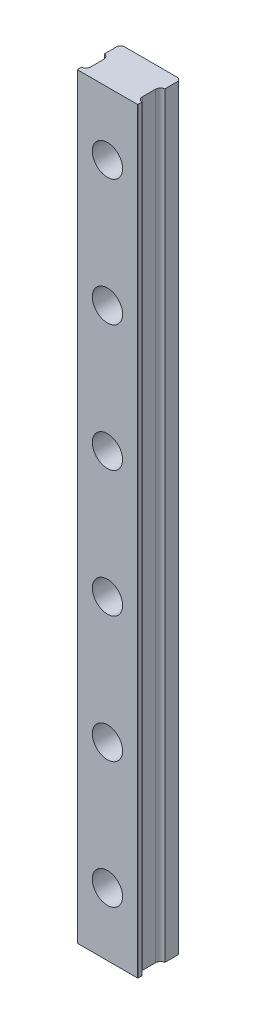
ISO-10303-21;
HEADER;
FILE_DESCRIPTION(('STEP AP214'),'2;1');
FILE_NAME('part.step','',(''),(''),'','','');
FILE_SCHEMA(('AUTOMOTIVE_DESIGN { 1 0 10303 214 1 1 1 1 }'));
ENDSEC;
DATA;
#1=APPLICATION_CONTEXT('core data for automotive mechanical design processes');
#2=APPLICATION_PROTOCOL_DEFINITION('international standard','automotive_design',2000,#1);
#3=PRODUCT_CONTEXT('',#1,'mechanical');
#4=PRODUCT('Part','Part','',(#3));
#5=PRODUCT_RELATED_PRODUCT_CATEGORY('part','',(#4));
#6=PRODUCT_DEFINITION_FORMATION('','',#4);
#7=PRODUCT_DEFINITION_CONTEXT('part definition',#1,'design');
#8=PRODUCT_DEFINITION('design','',#6,#7);
#9=PRODUCT_DEFINITION_SHAPE('','',#8);
#10=(LENGTH_UNIT() NAMED_UNIT(*) SI_UNIT(.MILLI.,.METRE.));
#11=(NAMED_UNIT(*) PLANE_ANGLE_UNIT() SI_UNIT($,.RADIAN.));
#12=(NAMED_UNIT(*) SI_UNIT($,.STERADIAN.) SOLID_ANGLE_UNIT());
#13=UNCERTAINTY_MEASURE_WITH_UNIT(LENGTH_MEASURE(1.E-05),#10,'distance_accuracy_value','');
#14=(GEOMETRIC_REPRESENTATION_CONTEXT(3) GLOBAL_UNCERTAINTY_ASSIGNED_CONTEXT((#13)) GLOBAL_UNIT_ASSIGNED_CONTEXT((#10,
#11,#12)) REPRESENTATION_CONTEXT('',''));
#15=CARTESIAN_POINT('',(0.,0.,0.));
#16=DIRECTION('',(0.,0.,1.));
#17=DIRECTION('',(1.,0.,0.));
#18=AXIS2_PLACEMENT_3D('',#15,#16,#17);
#19=CARTESIAN_POINT('',(0.,137.5,1.5));
#20=DIRECTION('',(0.,0.,1.));
#21=DIRECTION('',(0.,-1.,0.));
#22=AXIS2_PLACEMENT_3D('',#19,#20,#21);
#23=CYLINDRICAL_SURFACE('',#22,1.7);
#24=CARTESIAN_POINT('',(0.,137.5,0.));
#25=DIRECTION('',(0.,0.,1.));
#26=DIRECTION('',(0.,-1.,0.));
#27=AXIS2_PLACEMENT_3D('',#24,#25,#26);
#28=CIRCLE('',#27,1.7);
#29=CARTESIAN_POINT('',(0.,135.8,0.));
#30=VERTEX_POINT('',#29);
#31=EDGE_CURVE('E240',#30,#30,#28,.T.);
#32=ORIENTED_EDGE('',*,*,#31,.F.);
#33=EDGE_LOOP('',(#32));
#34=FACE_BOUND('',#33,.T.);
#35=CARTESIAN_POINT('',(0.,137.5,3.));
#36=DIRECTION('',(0.,0.,1.));
#37=DIRECTION('',(0.,-1.,0.));
#38=AXIS2_PLACEMENT_3D('',#35,#36,#37);
#39=CIRCLE('',#38,1.7);
#40=CARTESIAN_POINT('',(0.,135.8,3.));
#41=VERTEX_POINT('',#40);
#42=EDGE_CURVE('E334',#41,#41,#39,.T.);
#43=ORIENTED_EDGE('',*,*,#42,.T.);
#44=EDGE_LOOP('',(#43));
#45=FACE_BOUND('',#44,.T.);
#46=ADVANCED_FACE('F16',(#34,#45),#23,.F.);
#47=CARTESIAN_POINT('',(0.,112.5,1.5));
#48=DIRECTION('',(0.,0.,1.));
#49=DIRECTION('',(0.,-1.,0.));
#50=AXIS2_PLACEMENT_3D('',#47,#48,#49);
#51=CYLINDRICAL_SURFACE('',#50,1.7);
#52=CARTESIAN_POINT('',(0.,112.5,0.));
#53=DIRECTION('',(0.,0.,1.));
#54=DIRECTION('',(0.,-1.,0.));
#55=AXIS2_PLACEMENT_3D('',#52,#53,#54);
#56=CIRCLE('',#55,1.7);
#57=CARTESIAN_POINT('',(0.,110.8,0.));
#58=VERTEX_POINT('',#57);
#59=EDGE_CURVE('E315',#58,#58,#56,.T.);
#60=ORIENTED_EDGE('',*,*,#59,.F.);
#61=EDGE_LOOP('',(#60));
#62=FACE_BOUND('',#61,.T.);
#63=CARTESIAN_POINT('',(0.,112.5,3.));
#64=DIRECTION('',(0.,0.,1.));
#65=DIRECTION('',(0.,-1.,0.));
#66=AXIS2_PLACEMENT_3D('',#63,#64,#65);
#67=CIRCLE('',#66,1.7);
#68=CARTESIAN_POINT('',(0.,110.8,3.));
#69=VERTEX_POINT('',#68);
#70=EDGE_CURVE('E331',#69,#69,#67,.T.);
#71=ORIENTED_EDGE('',*,*,#70,.T.);
#72=EDGE_LOOP('',(#71));
#73=FACE_BOUND('',#72,.T.);
#74=ADVANCED_FACE('F522',(#62,#73),#51,.F.);
#75=CARTESIAN_POINT('',(0.,87.5,1.5));
#76=DIRECTION('',(0.,0.,1.));
#77=DIRECTION('',(0.,-1.,0.));
#78=AXIS2_PLACEMENT_3D('',#75,#76,#77);
#79=CYLINDRICAL_SURFACE('',#78,1.7);
#80=CARTESIAN_POINT('',(0.,87.5,0.));
#81=DIRECTION('',(0.,0.,1.));
#82=DIRECTION('',(0.,-1.,0.));
#83=AXIS2_PLACEMENT_3D('',#80,#81,#82);
#84=CIRCLE('',#83,1.7);
#85=CARTESIAN_POINT('',(0.,85.8,0.));
#86=VERTEX_POINT('',#85);
#87=EDGE_CURVE('E312',#86,#86,#84,.T.);
#88=ORIENTED_EDGE('',*,*,#87,.F.);
#89=EDGE_LOOP('',(#88));
#90=FACE_BOUND('',#89,.T.);
#91=CARTESIAN_POINT('',(0.,87.5,3.));
#92=DIRECTION('',(0.,0.,1.));
#93=DIRECTION('',(0.,-1.,0.));
#94=AXIS2_PLACEMENT_3D('',#91,#92,#93);
#95=CIRCLE('',#94,1.7);
#96=CARTESIAN_POINT('',(0.,85.8,3.));
#97=VERTEX_POINT('',#96);
#98=EDGE_CURVE('E328',#97,#97,#95,.T.);
#99=ORIENTED_EDGE('',*,*,#98,.T.);
#100=EDGE_LOOP('',(#99));
#101=FACE_BOUND('',#100,.T.);
#102=ADVANCED_FACE('F519',(#90,#101),#79,.F.);
#103=CARTESIAN_POINT('',(0.,62.5,1.5));
#104=DIRECTION('',(0.,0.,1.));
#105=DIRECTION('',(0.,-1.,0.));
#106=AXIS2_PLACEMENT_3D('',#103,#104,#105);
#107=CYLINDRICAL_SURFACE('',#106,1.7);
#108=CARTESIAN_POINT('',(0.,62.5,0.));
#109=DIRECTION('',(0.,0.,1.));
#110=DIRECTION('',(0.,-1.,0.));
#111=AXIS2_PLACEMENT_3D('',#108,#109,#110);
#112=CIRCLE('',#111,1.7);
#113=CARTESIAN_POINT('',(0.,60.8,0.));
#114=VERTEX_POINT('',#113);
#115=EDGE_CURVE('E309',#114,#114,#112,.T.);
#116=ORIENTED_EDGE('',*,*,#115,.F.);
#117=EDGE_LOOP('',(#116));
#118=FACE_BOUND('',#117,.T.);
#119=CARTESIAN_POINT('',(0.,62.5,3.));
#120=DIRECTION('',(0.,0.,1.));
#121=DIRECTION('',(0.,-1.,0.));
#122=AXIS2_PLACEMENT_3D('',#119,#120,#121);
#123=CIRCLE('',#122,1.7);
#124=CARTESIAN_POINT('',(0.,60.8,3.));
#125=VERTEX_POINT('',#124);
#126=EDGE_CURVE('E325',#125,#125,#123,.T.);
#127=ORIENTED_EDGE('',*,*,#126,.T.);
#128=EDGE_LOOP('',(#127));
#129=FACE_BOUND('',#128,.T.);
#130=ADVANCED_FACE('F515',(#118,#129),#107,.F.);
#131=CARTESIAN_POINT('',(0.,37.5,1.5));
#132=DIRECTION('',(0.,0.,1.));
#133=DIRECTION('',(0.,-1.,0.));
#134=AXIS2_PLACEMENT_3D('',#131,#132,#133);
#135=CYLINDRICAL_SURFACE('',#134,1.7);
#136=CARTESIAN_POINT('',(0.,37.5,0.));
#137=DIRECTION('',(0.,0.,1.));
#138=DIRECTION('',(0.,-1.,0.));
#139=AXIS2_PLACEMENT_3D('',#136,#137,#138);
#140=CIRCLE('',#139,1.7);
#141=CARTESIAN_POINT('',(0.,35.8,0.));
#142=VERTEX_POINT('',#141);
#143=EDGE_CURVE('E306',#142,#142,#140,.T.);
#144=ORIENTED_EDGE('',*,*,#143,.F.);
#145=EDGE_LOOP('',(#144));
#146=FACE_BOUND('',#145,.T.);
#147=CARTESIAN_POINT('',(0.,37.5,3.));
#148=DIRECTION('',(0.,0.,1.));
#149=DIRECTION('',(0.,-1.,0.));
#150=AXIS2_PLACEMENT_3D('',#147,#148,#149);
#151=CIRCLE('',#150,1.7);
#152=CARTESIAN_POINT('',(0.,35.8,3.));
#153=VERTEX_POINT('',#152);
#154=EDGE_CURVE('E322',#153,#153,#151,.T.);
#155=ORIENTED_EDGE('',*,*,#154,.T.);
#156=EDGE_LOOP('',(#155));
#157=FACE_BOUND('',#156,.T.);
#158=ADVANCED_FACE('F511',(#146,#157),#135,.F.);
#159=CARTESIAN_POINT('',(0.,12.5,1.5));
#160=DIRECTION('',(0.,0.,1.));
#161=DIRECTION('',(0.,-1.,0.));
#162=AXIS2_PLACEMENT_3D('',#159,#160,#161);
#163=CYLINDRICAL_SURFACE('',#162,1.7);
#164=CARTESIAN_POINT('',(0.,12.5,0.));
#165=DIRECTION('',(0.,0.,1.));
#166=DIRECTION('',(0.,-1.,0.));
#167=AXIS2_PLACEMENT_3D('',#164,#165,#166);
#168=CIRCLE('',#167,1.7);
#169=CARTESIAN_POINT('',(0.,10.8,0.));
#170=VERTEX_POINT('',#169);
#171=EDGE_CURVE('E267',#170,#170,#168,.T.);
#172=ORIENTED_EDGE('',*,*,#171,.F.);
#173=EDGE_LOOP('',(#172));
#174=FACE_BOUND('',#173,.T.);
#175=CARTESIAN_POINT('',(0.,12.5,3.));
#176=DIRECTION('',(0.,0.,1.));
#177=DIRECTION('',(0.,-1.,0.));
#178=AXIS2_PLACEMENT_3D('',#175,#176,#177);
#179=CIRCLE('',#178,1.7);
#180=CARTESIAN_POINT('',(0.,10.8,3.));
#181=VERTEX_POINT('',#180);
#182=EDGE_CURVE('E204',#181,#181,#179,.T.);
#183=ORIENTED_EDGE('',*,*,#182,.T.);
#184=EDGE_LOOP('',(#183));
#185=FACE_BOUND('',#184,.T.);
#186=ADVANCED_FACE('F507',(#174,#185),#163,.F.);
#187=CARTESIAN_POINT('',(5.75,0.,0.250000000000001));
#188=DIRECTION('',(0.707106781186548,0.,-0.707106781186548));
#189=DIRECTION('',(-0.707106781186548,0.,-0.707106781186548));
#190=AXIS2_PLACEMENT_3D('',#187,#188,#189);
#191=PLANE('',#190);
#192=DIRECTION('',(-0.707106781186548,0.,-0.707106781186548));
#193=VECTOR('',#192,1.);
#194=CARTESIAN_POINT('',(5.75,0.,0.250000000000001));
#195=LINE('',#194,#193);
#196=CARTESIAN_POINT('',(6.,0.,0.499999999999999));
#197=VERTEX_POINT('',#196);
#198=CARTESIAN_POINT('',(5.5,0.,0.));
#199=VERTEX_POINT('',#198);
#200=EDGE_CURVE('E138',#197,#199,#195,.T.);
#201=ORIENTED_EDGE('',*,*,#200,.T.);
#202=DIRECTION('',(0.,1.,0.));
#203=VECTOR('',#202,1.);
#204=CARTESIAN_POINT('',(5.5,0.,0.));
#205=LINE('',#204,#203);
#206=CARTESIAN_POINT('',(5.5,150.,0.));
#207=VERTEX_POINT('',#206);
#208=EDGE_CURVE('E252',#207,#199,#205,.F.);
#209=ORIENTED_EDGE('',*,*,#208,.F.);
#210=DIRECTION('',(-0.707106781186548,0.,-0.707106781186548));
#211=VECTOR('',#210,1.);
#212=CARTESIAN_POINT('',(5.75,150.,0.249999999999996));
#213=LINE('',#212,#211);
#214=CARTESIAN_POINT('',(6.,150.,0.499999999999995));
#215=VERTEX_POINT('',#214);
#216=EDGE_CURVE('E233',#207,#215,#213,.F.);
#217=ORIENTED_EDGE('',*,*,#216,.T.);
#218=DIRECTION('',(0.,1.,0.));
#219=VECTOR('',#218,1.);
#220=CARTESIAN_POINT('',(6.,0.,0.500000000000001));
#221=LINE('',#220,#219);
#222=EDGE_CURVE('E193',#197,#215,#221,.T.);
#223=ORIENTED_EDGE('',*,*,#222,.F.);
#224=EDGE_LOOP('',(#201,#209,#217,#223));
#225=FACE_BOUND('',#224,.T.);
#226=ADVANCED_FACE('F504',(#225),#191,.T.);
#227=CARTESIAN_POINT('',(6.12499999672743,0.,4.19999999876308));
#228=DIRECTION('',(0.,1.,0.));
#229=DIRECTION('',(0.,0.,1.));
#230=AXIS2_PLACEMENT_3D('',#227,#228,#229);
#231=CYLINDRICAL_SURFACE('',#230,0.999999996727427);
#232=CARTESIAN_POINT('',(6.12499999672743,0.,4.19999999876308));
#233=DIRECTION('',(0.,1.,0.));
#234=DIRECTION('',(0.,0.,1.));
#235=AXIS2_PLACEMENT_3D('',#232,#233,#234);
#236=CIRCLE('',#235,0.999999996727427);
#237=CARTESIAN_POINT('',(5.125,0.,4.19999999938154));
#238=VERTEX_POINT('',#237);
#239=CARTESIAN_POINT('',(6.,0.,3.20784326));
#240=VERTEX_POINT('',#239);
#241=EDGE_CURVE('E137',#238,#240,#236,.F.);
#242=ORIENTED_EDGE('',*,*,#241,.T.);
#243=DIRECTION('',(0.,1.,0.));
#244=VECTOR('',#243,1.);
#245=CARTESIAN_POINT('',(6.,0.,3.20784325999999));
#246=LINE('',#245,#244);
#247=CARTESIAN_POINT('',(6.,150.,3.20784325999999));
#248=VERTEX_POINT('',#247);
#249=EDGE_CURVE('E135',#248,#240,#246,.F.);
#250=ORIENTED_EDGE('',*,*,#249,.F.);
#251=CARTESIAN_POINT('',(6.12499999672743,150.,4.19999999876307));
#252=DIRECTION('',(0.,1.,0.));
#253=DIRECTION('',(0.,0.,1.));
#254=AXIS2_PLACEMENT_3D('',#251,#252,#253);
#255=CIRCLE('',#254,0.999999996727427);
#256=CARTESIAN_POINT('',(5.125,150.,4.19999999938154));
#257=VERTEX_POINT('',#256);
#258=EDGE_CURVE('E19',#248,#257,#255,.T.);
#259=ORIENTED_EDGE('',*,*,#258,.T.);
#260=DIRECTION('',(0.,1.,0.));
#261=VECTOR('',#260,1.);
#262=CARTESIAN_POINT('',(5.125,0.,4.2));
#263=LINE('',#262,#261);
#264=EDGE_CURVE('E132',#238,#257,#263,.T.);
#265=ORIENTED_EDGE('',*,*,#264,.F.);
#266=EDGE_LOOP('',(#242,#250,#259,#265));
#267=FACE_BOUND('',#266,.T.);
#268=ADVANCED_FACE('F131',(#267),#231,.F.);
#269=CARTESIAN_POINT('',(-6.12499999672743,0.,6.80000000123692));
#270=DIRECTION('',(0.,1.,0.));
#271=DIRECTION('',(0.,0.,1.));
#272=AXIS2_PLACEMENT_3D('',#269,#270,#271);
#273=CYLINDRICAL_SURFACE('',#272,0.999999996727429);
#274=CARTESIAN_POINT('',(-6.12499999672743,0.,6.80000000123692));
#275=DIRECTION('',(0.,1.,0.));
#276=DIRECTION('',(0.,0.,1.));
#277=AXIS2_PLACEMENT_3D('',#274,#275,#276);
#278=CIRCLE('',#277,0.999999996727429);
#279=CARTESIAN_POINT('',(-5.125,0.,6.80000000061846));
#280=VERTEX_POINT('',#279);
#281=CARTESIAN_POINT('',(-6.,0.,7.79215674));
#282=VERTEX_POINT('',#281);
#283=EDGE_CURVE('E225',#280,#282,#278,.F.);
#284=ORIENTED_EDGE('',*,*,#283,.T.);
#285=DIRECTION('',(0.,1.,0.));
#286=VECTOR('',#285,1.);
#287=CARTESIAN_POINT('',(-6.,0.,7.79215673999999));
#288=LINE('',#287,#286);
#289=CARTESIAN_POINT('',(-6.,150.,7.79215673999999));
#290=VERTEX_POINT('',#289);
#291=EDGE_CURVE('E200',#290,#282,#288,.F.);
#292=ORIENTED_EDGE('',*,*,#291,.F.);
#293=CARTESIAN_POINT('',(-6.12499999672743,150.,6.80000000123691));
#294=DIRECTION('',(0.,1.,0.));
#295=DIRECTION('',(0.,0.,1.));
#296=AXIS2_PLACEMENT_3D('',#293,#294,#295);
#297=CIRCLE('',#296,0.999999996727429);
#298=CARTESIAN_POINT('',(-5.125,150.,6.80000000061845));
#299=VERTEX_POINT('',#298);
#300=EDGE_CURVE('E344',#290,#299,#297,.T.);
#301=ORIENTED_EDGE('',*,*,#300,.T.);
#302=DIRECTION('',(0.,1.,0.));
#303=VECTOR('',#302,1.);
#304=CARTESIAN_POINT('',(-5.125,0.,6.8));
#305=LINE('',#304,#303);
#306=EDGE_CURVE('E172',#280,#299,#305,.T.);
#307=ORIENTED_EDGE('',*,*,#306,.F.);
#308=EDGE_LOOP('',(#284,#292,#301,#307));
#309=FACE_BOUND('',#308,.T.);
#310=ADVANCED_FACE('F375',(#309),#273,.F.);
#311=CARTESIAN_POINT('',(-5.75,0.,0.25));
#312=DIRECTION('',(-0.707106781186548,0.,-0.707106781186548));
#313=DIRECTION('',(-0.707106781186548,0.,0.707106781186548));
#314=AXIS2_PLACEMENT_3D('',#311,#312,#313);
#315=PLANE('',#314);
#316=DIRECTION('',(-0.707106781186548,0.,0.707106781186548));
#317=VECTOR('',#316,1.);
#318=CARTESIAN_POINT('',(-5.75,0.,0.25));
#319=LINE('',#318,#317);
#320=CARTESIAN_POINT('',(-5.5,0.,0.));
#321=VERTEX_POINT('',#320);
#322=CARTESIAN_POINT('',(-6.,0.,0.499999999999997));
#323=VERTEX_POINT('',#322);
#324=EDGE_CURVE('E224',#321,#323,#319,.T.);
#325=ORIENTED_EDGE('',*,*,#324,.T.);
#326=DIRECTION('',(0.,1.,0.));
#327=VECTOR('',#326,1.);
#328=CARTESIAN_POINT('',(-6.,0.,0.499999999999991));
#329=LINE('',#328,#327);
#330=CARTESIAN_POINT('',(-6.,150.,0.499999999999992));
#331=VERTEX_POINT('',#330);
#332=EDGE_CURVE('E169',#331,#323,#329,.F.);
#333=ORIENTED_EDGE('',*,*,#332,.F.);
#334=DIRECTION('',(-0.707106781186548,0.,0.707106781186548));
#335=VECTOR('',#334,1.);
#336=CARTESIAN_POINT('',(-5.75,150.,0.249999999999995));
#337=LINE('',#336,#335);
#338=CARTESIAN_POINT('',(-5.5,150.,0.));
#339=VERTEX_POINT('',#338);
#340=EDGE_CURVE('E222',#331,#339,#337,.F.);
#341=ORIENTED_EDGE('',*,*,#340,.T.);
#342=DIRECTION('',(0.,1.,0.));
#343=VECTOR('',#342,1.);
#344=CARTESIAN_POINT('',(-5.5,0.,0.));
#345=LINE('',#344,#343);
#346=EDGE_CURVE('E195',#321,#339,#345,.T.);
#347=ORIENTED_EDGE('',*,*,#346,.F.);
#348=EDGE_LOOP('',(#325,#333,#341,#347));
#349=FACE_BOUND('',#348,.T.);
#350=ADVANCED_FACE('F495',(#349),#315,.T.);
#351=CARTESIAN_POINT('',(-6.12500000163629,0.,4.20000000309229));
#352=DIRECTION('',(0.,1.,0.));
#353=DIRECTION('',(0.,0.,1.));
#354=AXIS2_PLACEMENT_3D('',#351,#352,#353);
#355=CYLINDRICAL_SURFACE('',#354,1.00000000163629);
#356=CARTESIAN_POINT('',(-6.12500000163629,0.,4.20000000309229));
#357=DIRECTION('',(0.,1.,0.));
#358=DIRECTION('',(0.,0.,1.));
#359=AXIS2_PLACEMENT_3D('',#356,#357,#358);
#360=CIRCLE('',#359,1.00000000163629);
#361=CARTESIAN_POINT('',(-6.,0.,3.20784326));
#362=VERTEX_POINT('',#361);
#363=CARTESIAN_POINT('',(-5.125,0.,4.20000000154614));
#364=VERTEX_POINT('',#363);
#365=EDGE_CURVE('E340',#362,#364,#360,.F.);
#366=ORIENTED_EDGE('',*,*,#365,.T.);
#367=DIRECTION('',(0.,1.,0.));
#368=VECTOR('',#367,1.);
#369=CARTESIAN_POINT('',(-5.125,0.,4.19999999999999));
#370=LINE('',#369,#368);
#371=CARTESIAN_POINT('',(-5.125,150.,4.20000000154613));
#372=VERTEX_POINT('',#371);
#373=EDGE_CURVE('E146',#372,#364,#370,.F.);
#374=ORIENTED_EDGE('',*,*,#373,.F.);
#375=CARTESIAN_POINT('',(-6.12500000163629,150.,4.20000000309228));
#376=DIRECTION('',(0.,1.,0.));
#377=DIRECTION('',(0.,0.,1.));
#378=AXIS2_PLACEMENT_3D('',#375,#376,#377);
#379=CIRCLE('',#378,1.00000000163629);
#380=CARTESIAN_POINT('',(-6.,150.,3.20784326));
#381=VERTEX_POINT('',#380);
#382=EDGE_CURVE('E229',#372,#381,#379,.T.);
#383=ORIENTED_EDGE('',*,*,#382,.T.);
#384=DIRECTION('',(0.,1.,0.));
#385=VECTOR('',#384,1.);
#386=CARTESIAN_POINT('',(-6.,0.,3.20784326));
#387=LINE('',#386,#385);
#388=EDGE_CURVE('E165',#362,#381,#387,.T.);
#389=ORIENTED_EDGE('',*,*,#388,.F.);
#390=EDGE_LOOP('',(#366,#374,#383,#389));
#391=FACE_BOUND('',#390,.T.);
#392=ADVANCED_FACE('F491',(#391),#355,.F.);
#393=CARTESIAN_POINT('',(6.12500000163629,0.,6.79999999690771));
#394=DIRECTION('',(0.,1.,0.));
#395=DIRECTION('',(0.,0.,1.));
#396=AXIS2_PLACEMENT_3D('',#393,#394,#395);
#397=CYLINDRICAL_SURFACE('',#396,1.00000000163628);
#398=CARTESIAN_POINT('',(6.12500000163629,0.,6.79999999690771));
#399=DIRECTION('',(0.,1.,0.));
#400=DIRECTION('',(0.,0.,1.));
#401=AXIS2_PLACEMENT_3D('',#398,#399,#400);
#402=CIRCLE('',#401,1.00000000163628);
#403=CARTESIAN_POINT('',(6.,0.,7.79215674));
#404=VERTEX_POINT('',#403);
#405=CARTESIAN_POINT('',(5.125,0.,6.79999999845385));
#406=VERTEX_POINT('',#405);
#407=EDGE_CURVE('E337',#404,#406,#402,.F.);
#408=ORIENTED_EDGE('',*,*,#407,.T.);
#409=DIRECTION('',(0.,1.,0.));
#410=VECTOR('',#409,1.);
#411=CARTESIAN_POINT('',(5.125,0.,6.79999999999999));
#412=LINE('',#411,#410);
#413=CARTESIAN_POINT('',(5.125,150.,6.79999999845385));
#414=VERTEX_POINT('',#413);
#415=EDGE_CURVE('E147',#414,#406,#412,.F.);
#416=ORIENTED_EDGE('',*,*,#415,.F.);
#417=CARTESIAN_POINT('',(6.12500000163629,150.,6.7999999969077));
#418=DIRECTION('',(0.,1.,0.));
#419=DIRECTION('',(0.,0.,1.));
#420=AXIS2_PLACEMENT_3D('',#417,#418,#419);
#421=CIRCLE('',#420,1.00000000163628);
#422=CARTESIAN_POINT('',(6.,150.,7.79215674));
#423=VERTEX_POINT('',#422);
#424=EDGE_CURVE('E151',#414,#423,#421,.T.);
#425=ORIENTED_EDGE('',*,*,#424,.T.);
#426=DIRECTION('',(0.,1.,0.));
#427=VECTOR('',#426,1.);
#428=CARTESIAN_POINT('',(6.,0.,7.79215674));
#429=LINE('',#428,#427);
#430=EDGE_CURVE('E168',#404,#423,#429,.T.);
#431=ORIENTED_EDGE('',*,*,#430,.F.);
#432=EDGE_LOOP('',(#408,#416,#425,#431));
#433=FACE_BOUND('',#432,.T.);
#434=ADVANCED_FACE('F487',(#433),#397,.F.);
#435=CARTESIAN_POINT('',(2.35,137.5,3.));
#436=DIRECTION('',(0.,0.,-1.));
#437=DIRECTION('',(0.,1.,0.));
#438=AXIS2_PLACEMENT_3D('',#435,#436,#437);
#439=PLANE('',#438);
#440=ORIENTED_EDGE('',*,*,#42,.F.);
#441=EDGE_LOOP('',(#440));
#442=FACE_BOUND('',#441,.T.);
#443=CARTESIAN_POINT('',(0.,137.5,3.));
#444=DIRECTION('',(0.,0.,1.));
#445=DIRECTION('',(0.,-1.,0.));
#446=AXIS2_PLACEMENT_3D('',#443,#444,#445);
#447=CIRCLE('',#446,3.);
#448=CARTESIAN_POINT('',(0.,134.5,3.));
#449=VERTEX_POINT('',#448);
#450=EDGE_CURVE('E181',#449,#449,#447,.T.);
#451=ORIENTED_EDGE('',*,*,#450,.T.);
#452=EDGE_LOOP('',(#451));
#453=FACE_BOUND('',#452,.T.);
#454=ADVANCED_FACE('F483',(#442,#453),#439,.F.);
#455=CARTESIAN_POINT('',(2.35,112.5,3.));
#456=DIRECTION('',(0.,0.,-1.));
#457=DIRECTION('',(0.,1.,0.));
#458=AXIS2_PLACEMENT_3D('',#455,#456,#457);
#459=PLANE('',#458);
#460=ORIENTED_EDGE('',*,*,#70,.F.);
#461=EDGE_LOOP('',(#460));
#462=FACE_BOUND('',#461,.T.);
#463=CARTESIAN_POINT('',(0.,112.5,3.));
#464=DIRECTION('',(0.,0.,1.));
#465=DIRECTION('',(0.,-1.,0.));
#466=AXIS2_PLACEMENT_3D('',#463,#464,#465);
#467=CIRCLE('',#466,3.);
#468=CARTESIAN_POINT('',(0.,109.5,3.));
#469=VERTEX_POINT('',#468);
#470=EDGE_CURVE('E299',#469,#469,#467,.T.);
#471=ORIENTED_EDGE('',*,*,#470,.T.);
#472=EDGE_LOOP('',(#471));
#473=FACE_BOUND('',#472,.T.);
#474=ADVANCED_FACE('F479',(#462,#473),#459,.F.);
#475=CARTESIAN_POINT('',(2.35,87.5,3.));
#476=DIRECTION('',(0.,0.,-1.));
#477=DIRECTION('',(0.,1.,0.));
#478=AXIS2_PLACEMENT_3D('',#475,#476,#477);
#479=PLANE('',#478);
#480=ORIENTED_EDGE('',*,*,#98,.F.);
#481=EDGE_LOOP('',(#480));
#482=FACE_BOUND('',#481,.T.);
#483=CARTESIAN_POINT('',(0.,87.5,3.));
#484=DIRECTION('',(0.,0.,1.));
#485=DIRECTION('',(0.,-1.,0.));
#486=AXIS2_PLACEMENT_3D('',#483,#484,#485);
#487=CIRCLE('',#486,3.);
#488=CARTESIAN_POINT('',(0.,84.5,3.));
#489=VERTEX_POINT('',#488);
#490=EDGE_CURVE('E296',#489,#489,#487,.T.);
#491=ORIENTED_EDGE('',*,*,#490,.T.);
#492=EDGE_LOOP('',(#491));
#493=FACE_BOUND('',#492,.T.);
#494=ADVANCED_FACE('F475',(#482,#493),#479,.F.);
#495=CARTESIAN_POINT('',(2.35,62.5,3.));
#496=DIRECTION('',(0.,0.,-1.));
#497=DIRECTION('',(0.,1.,0.));
#498=AXIS2_PLACEMENT_3D('',#495,#496,#497);
#499=PLANE('',#498);
#500=ORIENTED_EDGE('',*,*,#126,.F.);
#501=EDGE_LOOP('',(#500));
#502=FACE_BOUND('',#501,.T.);
#503=CARTESIAN_POINT('',(0.,62.5,3.));
#504=DIRECTION('',(0.,0.,1.));
#505=DIRECTION('',(0.,-1.,0.));
#506=AXIS2_PLACEMENT_3D('',#503,#504,#505);
#507=CIRCLE('',#506,3.);
#508=CARTESIAN_POINT('',(0.,59.5,3.));
#509=VERTEX_POINT('',#508);
#510=EDGE_CURVE('E293',#509,#509,#507,.T.);
#511=ORIENTED_EDGE('',*,*,#510,.T.);
#512=EDGE_LOOP('',(#511));
#513=FACE_BOUND('',#512,.T.);
#514=ADVANCED_FACE('F471',(#502,#513),#499,.F.);
#515=CARTESIAN_POINT('',(2.35,37.5,3.));
#516=DIRECTION('',(0.,0.,-1.));
#517=DIRECTION('',(0.,1.,0.));
#518=AXIS2_PLACEMENT_3D('',#515,#516,#517);
#519=PLANE('',#518);
#520=ORIENTED_EDGE('',*,*,#154,.F.);
#521=EDGE_LOOP('',(#520));
#522=FACE_BOUND('',#521,.T.);
#523=CARTESIAN_POINT('',(0.,37.5,3.));
#524=DIRECTION('',(0.,0.,1.));
#525=DIRECTION('',(0.,-1.,0.));
#526=AXIS2_PLACEMENT_3D('',#523,#524,#525);
#527=CIRCLE('',#526,3.);
#528=CARTESIAN_POINT('',(0.,34.5,3.));
#529=VERTEX_POINT('',#528);
#530=EDGE_CURVE('E290',#529,#529,#527,.T.);
#531=ORIENTED_EDGE('',*,*,#530,.T.);
#532=EDGE_LOOP('',(#531));
#533=FACE_BOUND('',#532,.T.);
#534=ADVANCED_FACE('F467',(#522,#533),#519,.F.);
#535=CARTESIAN_POINT('',(2.35,12.5,3.));
#536=DIRECTION('',(0.,0.,-1.));
#537=DIRECTION('',(0.,1.,0.));
#538=AXIS2_PLACEMENT_3D('',#535,#536,#537);
#539=PLANE('',#538);
#540=ORIENTED_EDGE('',*,*,#182,.F.);
#541=EDGE_LOOP('',(#540));
#542=FACE_BOUND('',#541,.T.);
#543=CARTESIAN_POINT('',(0.,12.5,3.));
#544=DIRECTION('',(0.,0.,1.));
#545=DIRECTION('',(0.,-1.,0.));
#546=AXIS2_PLACEMENT_3D('',#543,#544,#545);
#547=CIRCLE('',#546,3.);
#548=CARTESIAN_POINT('',(0.,9.5,3.));
#549=VERTEX_POINT('',#548);
#550=EDGE_CURVE('E158',#549,#549,#547,.T.);
#551=ORIENTED_EDGE('',*,*,#550,.T.);
#552=EDGE_LOOP('',(#551));
#553=FACE_BOUND('',#552,.T.);
#554=ADVANCED_FACE('F464',(#542,#553),#539,.F.);
#555=CARTESIAN_POINT('',(-6.,0.,8.17107837));
#556=DIRECTION('',(-1.,0.,0.));
#557=DIRECTION('',(0.,0.,1.));
#558=AXIS2_PLACEMENT_3D('',#555,#556,#557);
#559=PLANE('',#558);
#560=DIRECTION('',(0.,0.,1.));
#561=VECTOR('',#560,1.);
#562=CARTESIAN_POINT('',(-6.,0.,8.17107837));
#563=LINE('',#562,#561);
#564=CARTESIAN_POINT('',(-6.,0.,8.55));
#565=VERTEX_POINT('',#564);
#566=EDGE_CURVE('E203',#282,#565,#563,.T.);
#567=ORIENTED_EDGE('',*,*,#566,.T.);
#568=DIRECTION('',(0.,1.,0.));
#569=VECTOR('',#568,1.);
#570=CARTESIAN_POINT('',(-6.,0.,8.55));
#571=LINE('',#570,#569);
#572=CARTESIAN_POINT('',(-6.,150.,8.54999999999999));
#573=VERTEX_POINT('',#572);
#574=EDGE_CURVE('E205',#573,#565,#571,.F.);
#575=ORIENTED_EDGE('',*,*,#574,.F.);
#576=DIRECTION('',(0.,0.,-1.));
#577=VECTOR('',#576,1.);
#578=CARTESIAN_POINT('',(-6.,150.,4.40728174978889));
#579=LINE('',#578,#577);
#580=EDGE_CURVE('E156',#573,#290,#579,.T.);
#581=ORIENTED_EDGE('',*,*,#580,.T.);
#582=ORIENTED_EDGE('',*,*,#291,.T.);
#583=EDGE_LOOP('',(#567,#575,#581,#582));
#584=FACE_BOUND('',#583,.T.);
#585=ADVANCED_FACE('F369',(#584),#559,.T.);
#586=CARTESIAN_POINT('',(0.,0.,0.));
#587=DIRECTION('',(0.,0.,-1.));
#588=DIRECTION('',(-1.,0.,0.));
#589=AXIS2_PLACEMENT_3D('',#586,#587,#588);
#590=PLANE('',#589);
#591=DIRECTION('',(1.,0.,0.));
#592=VECTOR('',#591,1.);
#593=CARTESIAN_POINT('',(0.,0.,0.));
#594=LINE('',#593,#592);
#595=EDGE_CURVE('E208',#321,#199,#594,.T.);
#596=ORIENTED_EDGE('',*,*,#595,.F.);
#597=ORIENTED_EDGE('',*,*,#346,.T.);
#598=DIRECTION('',(1.,0.,0.));
#599=VECTOR('',#598,1.);
#600=CARTESIAN_POINT('',(0.,150.,0.));
#601=LINE('',#600,#599);
#602=EDGE_CURVE('E214',#339,#207,#601,.T.);
#603=ORIENTED_EDGE('',*,*,#602,.T.);
#604=ORIENTED_EDGE('',*,*,#208,.T.);
#605=EDGE_LOOP('',(#596,#597,#603,#604));
#606=FACE_BOUND('',#605,.T.);
#607=ORIENTED_EDGE('',*,*,#171,.T.);
#608=EDGE_LOOP('',(#607));
#609=FACE_BOUND('',#608,.T.);
#610=ORIENTED_EDGE('',*,*,#143,.T.);
#611=EDGE_LOOP('',(#610));
#612=FACE_BOUND('',#611,.T.);
#613=ORIENTED_EDGE('',*,*,#115,.T.);
#614=EDGE_LOOP('',(#613));
#615=FACE_BOUND('',#614,.T.);
#616=ORIENTED_EDGE('',*,*,#87,.T.);
#617=EDGE_LOOP('',(#616));
#618=FACE_BOUND('',#617,.T.);
#619=ORIENTED_EDGE('',*,*,#59,.T.);
#620=EDGE_LOOP('',(#619));
#621=FACE_BOUND('',#620,.T.);
#622=ORIENTED_EDGE('',*,*,#31,.T.);
#623=EDGE_LOOP('',(#622));
#624=FACE_BOUND('',#623,.T.);
#625=ADVANCED_FACE('F458',(#606,#609,#612,#615,#618,#621,#624),#590,.T.);
#626=CARTESIAN_POINT('',(6.,0.,1.85392163));
#627=DIRECTION('',(1.,0.,0.));
#628=DIRECTION('',(0.,0.,-1.));
#629=AXIS2_PLACEMENT_3D('',#626,#627,#628);
#630=PLANE('',#629);
#631=DIRECTION('',(0.,0.,-1.));
#632=VECTOR('',#631,1.);
#633=CARTESIAN_POINT('',(6.,0.,4.4072817497889));
#634=LINE('',#633,#632);
#635=EDGE_CURVE('E257',#197,#240,#634,.F.);
#636=ORIENTED_EDGE('',*,*,#635,.F.);
#637=ORIENTED_EDGE('',*,*,#222,.T.);
#638=DIRECTION('',(0.,0.,-1.));
#639=VECTOR('',#638,1.);
#640=CARTESIAN_POINT('',(6.,150.,4.40728174978889));
#641=LINE('',#640,#639);
#642=EDGE_CURVE('E154',#215,#248,#641,.F.);
#643=ORIENTED_EDGE('',*,*,#642,.T.);
#644=ORIENTED_EDGE('',*,*,#249,.T.);
#645=EDGE_LOOP('',(#636,#637,#643,#644));
#646=FACE_BOUND('',#645,.T.);
#647=ADVANCED_FACE('F348',(#646),#630,.T.);
#648=CARTESIAN_POINT('',(5.125,0.,5.5));
#649=DIRECTION('',(1.,0.,0.));
#650=DIRECTION('',(0.,0.,-1.));
#651=AXIS2_PLACEMENT_3D('',#648,#649,#650);
#652=PLANE('',#651);
#653=DIRECTION('',(0.,0.,-1.));
#654=VECTOR('',#653,1.);
#655=CARTESIAN_POINT('',(5.125,0.,4.4072817497889));
#656=LINE('',#655,#654);
#657=EDGE_CURVE('E145',#238,#406,#656,.F.);
#658=ORIENTED_EDGE('',*,*,#657,.F.);
#659=ORIENTED_EDGE('',*,*,#264,.T.);
#660=DIRECTION('',(0.,0.,-1.));
#661=VECTOR('',#660,1.);
#662=CARTESIAN_POINT('',(5.125,150.,4.40728174978889));
#663=LINE('',#662,#661);
#664=EDGE_CURVE('E143',#257,#414,#663,.F.);
#665=ORIENTED_EDGE('',*,*,#664,.T.);
#666=ORIENTED_EDGE('',*,*,#415,.T.);
#667=EDGE_LOOP('',(#658,#659,#665,#666));
#668=FACE_BOUND('',#667,.T.);
#669=ADVANCED_FACE('F141',(#668),#652,.T.);
#670=CARTESIAN_POINT('',(-5.125,0.,5.5));
#671=DIRECTION('',(-1.,0.,0.));
#672=DIRECTION('',(0.,0.,1.));
#673=AXIS2_PLACEMENT_3D('',#670,#671,#672);
#674=PLANE('',#673);
#675=DIRECTION('',(0.,0.,-1.));
#676=VECTOR('',#675,1.);
#677=CARTESIAN_POINT('',(-5.125,0.,4.4072817497889));
#678=LINE('',#677,#676);
#679=EDGE_CURVE('E246',#280,#364,#678,.T.);
#680=ORIENTED_EDGE('',*,*,#679,.F.);
#681=ORIENTED_EDGE('',*,*,#306,.T.);
#682=DIRECTION('',(0.,0.,-1.));
#683=VECTOR('',#682,1.);
#684=CARTESIAN_POINT('',(-5.125,150.,4.40728174978889));
#685=LINE('',#684,#683);
#686=EDGE_CURVE('E359',#299,#372,#685,.T.);
#687=ORIENTED_EDGE('',*,*,#686,.T.);
#688=ORIENTED_EDGE('',*,*,#373,.T.);
#689=EDGE_LOOP('',(#680,#681,#687,#688));
#690=FACE_BOUND('',#689,.T.);
#691=ADVANCED_FACE('F449',(#690),#674,.T.);
#692=CARTESIAN_POINT('',(-6.,0.,1.85392163));
#693=DIRECTION('',(-1.,0.,0.));
#694=DIRECTION('',(0.,0.,1.));
#695=AXIS2_PLACEMENT_3D('',#692,#693,#694);
#696=PLANE('',#695);
#697=DIRECTION('',(0.,0.,-1.));
#698=VECTOR('',#697,1.);
#699=CARTESIAN_POINT('',(-6.,0.,4.4072817497889));
#700=LINE('',#699,#698);
#701=EDGE_CURVE('E219',#362,#323,#700,.T.);
#702=ORIENTED_EDGE('',*,*,#701,.F.);
#703=ORIENTED_EDGE('',*,*,#388,.T.);
#704=DIRECTION('',(0.,0.,-1.));
#705=VECTOR('',#704,1.);
#706=CARTESIAN_POINT('',(-6.,150.,4.40728174978889));
#707=LINE('',#706,#705);
#708=EDGE_CURVE('E262',#381,#331,#707,.T.);
#709=ORIENTED_EDGE('',*,*,#708,.T.);
#710=ORIENTED_EDGE('',*,*,#332,.T.);
#711=EDGE_LOOP('',(#702,#703,#709,#710));
#712=FACE_BOUND('',#711,.T.);
#713=ADVANCED_FACE('F446',(#712),#696,.T.);
#714=CARTESIAN_POINT('',(6.,0.,8.17107837));
#715=DIRECTION('',(1.,0.,0.));
#716=DIRECTION('',(0.,0.,-1.));
#717=AXIS2_PLACEMENT_3D('',#714,#715,#716);
#718=PLANE('',#717);
#719=DIRECTION('',(0.,0.,-1.));
#720=VECTOR('',#719,1.);
#721=CARTESIAN_POINT('',(6.,0.,4.4072817497889));
#722=LINE('',#721,#720);
#723=CARTESIAN_POINT('',(6.,0.,8.55));
#724=VERTEX_POINT('',#723);
#725=EDGE_CURVE('E247',#404,#724,#722,.F.);
#726=ORIENTED_EDGE('',*,*,#725,.F.);
#727=ORIENTED_EDGE('',*,*,#430,.T.);
#728=DIRECTION('',(0.,0.,-1.));
#729=VECTOR('',#728,1.);
#730=CARTESIAN_POINT('',(6.,150.,4.40728174978889));
#731=LINE('',#730,#729);
#732=CARTESIAN_POINT('',(6.,150.,8.54999999999999));
#733=VERTEX_POINT('',#732);
#734=EDGE_CURVE('E153',#423,#733,#731,.F.);
#735=ORIENTED_EDGE('',*,*,#734,.T.);
#736=DIRECTION('',(0.,1.,0.));
#737=VECTOR('',#736,1.);
#738=CARTESIAN_POINT('',(6.,0.,8.55));
#739=LINE('',#738,#737);
#740=EDGE_CURVE('E182',#724,#733,#739,.T.);
#741=ORIENTED_EDGE('',*,*,#740,.F.);
#742=EDGE_LOOP('',(#726,#727,#735,#741));
#743=FACE_BOUND('',#742,.T.);
#744=ADVANCED_FACE('F403',(#743),#718,.T.);
#745=CARTESIAN_POINT('',(0.,137.5,5.8));
#746=DIRECTION('',(0.,0.,1.));
#747=DIRECTION('',(0.,-1.,0.));
#748=AXIS2_PLACEMENT_3D('',#745,#746,#747);
#749=CYLINDRICAL_SURFACE('',#748,3.);
#750=CARTESIAN_POINT('',(0.,137.5,8.6));
#751=DIRECTION('',(0.,0.,1.));
#752=DIRECTION('',(0.,-1.,0.));
#753=AXIS2_PLACEMENT_3D('',#750,#751,#752);
#754=CIRCLE('',#753,3.);
#755=CARTESIAN_POINT('',(0.,134.5,8.6));
#756=VERTEX_POINT('',#755);
#757=EDGE_CURVE('E185',#756,#756,#754,.F.);
#758=ORIENTED_EDGE('',*,*,#757,.F.);
#759=EDGE_LOOP('',(#758));
#760=FACE_BOUND('',#759,.T.);
#761=ORIENTED_EDGE('',*,*,#450,.F.);
#762=EDGE_LOOP('',(#761));
#763=FACE_BOUND('',#762,.T.);
#764=ADVANCED_FACE('F439',(#760,#763),#749,.F.);
#765=CARTESIAN_POINT('',(0.,112.5,5.8));
#766=DIRECTION('',(0.,0.,1.));
#767=DIRECTION('',(0.,-1.,0.));
#768=AXIS2_PLACEMENT_3D('',#765,#766,#767);
#769=CYLINDRICAL_SURFACE('',#768,3.);
#770=CARTESIAN_POINT('',(0.,112.5,8.6));
#771=DIRECTION('',(0.,0.,1.));
#772=DIRECTION('',(0.,-1.,0.));
#773=AXIS2_PLACEMENT_3D('',#770,#771,#772);
#774=CIRCLE('',#773,3.);
#775=CARTESIAN_POINT('',(0.,109.5,8.6));
#776=VERTEX_POINT('',#775);
#777=EDGE_CURVE('E283',#776,#776,#774,.F.);
#778=ORIENTED_EDGE('',*,*,#777,.F.);
#779=EDGE_LOOP('',(#778));
#780=FACE_BOUND('',#779,.T.);
#781=ORIENTED_EDGE('',*,*,#470,.F.);
#782=EDGE_LOOP('',(#781));
#783=FACE_BOUND('',#782,.T.);
#784=ADVANCED_FACE('F435',(#780,#783),#769,.F.);
#785=CARTESIAN_POINT('',(0.,87.5,5.8));
#786=DIRECTION('',(0.,0.,1.));
#787=DIRECTION('',(0.,-1.,0.));
#788=AXIS2_PLACEMENT_3D('',#785,#786,#787);
#789=CYLINDRICAL_SURFACE('',#788,3.);
#790=CARTESIAN_POINT('',(0.,87.5,8.6));
#791=DIRECTION('',(0.,0.,1.));
#792=DIRECTION('',(0.,-1.,0.));
#793=AXIS2_PLACEMENT_3D('',#790,#791,#792);
#794=CIRCLE('',#793,3.);
#795=CARTESIAN_POINT('',(0.,84.5,8.6));
#796=VERTEX_POINT('',#795);
#797=EDGE_CURVE('E280',#796,#796,#794,.F.);
#798=ORIENTED_EDGE('',*,*,#797,.F.);
#799=EDGE_LOOP('',(#798));
#800=FACE_BOUND('',#799,.T.);
#801=ORIENTED_EDGE('',*,*,#490,.F.);
#802=EDGE_LOOP('',(#801));
#803=FACE_BOUND('',#802,.T.);
#804=ADVANCED_FACE('F431',(#800,#803),#789,.F.);
#805=CARTESIAN_POINT('',(0.,62.5,5.8));
#806=DIRECTION('',(0.,0.,1.));
#807=DIRECTION('',(0.,-1.,0.));
#808=AXIS2_PLACEMENT_3D('',#805,#806,#807);
#809=CYLINDRICAL_SURFACE('',#808,3.);
#810=CARTESIAN_POINT('',(0.,62.5,8.6));
#811=DIRECTION('',(0.,0.,1.));
#812=DIRECTION('',(0.,-1.,0.));
#813=AXIS2_PLACEMENT_3D('',#810,#811,#812);
#814=CIRCLE('',#813,3.);
#815=CARTESIAN_POINT('',(0.,59.5,8.6));
#816=VERTEX_POINT('',#815);
#817=EDGE_CURVE('E277',#816,#816,#814,.F.);
#818=ORIENTED_EDGE('',*,*,#817,.F.);
#819=EDGE_LOOP('',(#818));
#820=FACE_BOUND('',#819,.T.);
#821=ORIENTED_EDGE('',*,*,#510,.F.);
#822=EDGE_LOOP('',(#821));
#823=FACE_BOUND('',#822,.T.);
#824=ADVANCED_FACE('F427',(#820,#823),#809,.F.);
#825=CARTESIAN_POINT('',(0.,37.5,5.8));
#826=DIRECTION('',(0.,0.,1.));
#827=DIRECTION('',(0.,-1.,0.));
#828=AXIS2_PLACEMENT_3D('',#825,#826,#827);
#829=CYLINDRICAL_SURFACE('',#828,3.);
#830=CARTESIAN_POINT('',(0.,37.5,8.6));
#831=DIRECTION('',(0.,0.,1.));
#832=DIRECTION('',(0.,-1.,0.));
#833=AXIS2_PLACEMENT_3D('',#830,#831,#832);
#834=CIRCLE('',#833,3.);
#835=CARTESIAN_POINT('',(0.,34.5,8.6));
#836=VERTEX_POINT('',#835);
#837=EDGE_CURVE('E274',#836,#836,#834,.F.);
#838=ORIENTED_EDGE('',*,*,#837,.F.);
#839=EDGE_LOOP('',(#838));
#840=FACE_BOUND('',#839,.T.);
#841=ORIENTED_EDGE('',*,*,#530,.F.);
#842=EDGE_LOOP('',(#841));
#843=FACE_BOUND('',#842,.T.);
#844=ADVANCED_FACE('F423',(#840,#843),#829,.F.);
#845=CARTESIAN_POINT('',(0.,12.5,5.8));
#846=DIRECTION('',(0.,0.,1.));
#847=DIRECTION('',(0.,-1.,0.));
#848=AXIS2_PLACEMENT_3D('',#845,#846,#847);
#849=CYLINDRICAL_SURFACE('',#848,3.);
#850=CARTESIAN_POINT('',(0.,12.5,8.6));
#851=DIRECTION('',(0.,0.,1.));
#852=DIRECTION('',(0.,-1.,0.));
#853=AXIS2_PLACEMENT_3D('',#850,#851,#852);
#854=CIRCLE('',#853,3.);
#855=CARTESIAN_POINT('',(0.,9.5,8.6));
#856=VERTEX_POINT('',#855);
#857=EDGE_CURVE('E270',#856,#856,#854,.F.);
#858=ORIENTED_EDGE('',*,*,#857,.F.);
#859=EDGE_LOOP('',(#858));
#860=FACE_BOUND('',#859,.T.);
#861=ORIENTED_EDGE('',*,*,#550,.F.);
#862=EDGE_LOOP('',(#861));
#863=FACE_BOUND('',#862,.T.);
#864=ADVANCED_FACE('F420',(#860,#863),#849,.F.);
#865=CARTESIAN_POINT('',(0.,150.,4.40728174978889));
#866=DIRECTION('',(0.,-1.,0.));
#867=DIRECTION('',(0.,0.,-1.));
#868=AXIS2_PLACEMENT_3D('',#865,#866,#867);
#869=PLANE('',#868);
#870=ORIENTED_EDGE('',*,*,#340,.F.);
#871=ORIENTED_EDGE('',*,*,#708,.F.);
#872=ORIENTED_EDGE('',*,*,#382,.F.);
#873=ORIENTED_EDGE('',*,*,#686,.F.);
#874=ORIENTED_EDGE('',*,*,#300,.F.);
#875=ORIENTED_EDGE('',*,*,#580,.F.);
#876=DIRECTION('',(0.707106781186541,0.,0.707106781186554));
#877=VECTOR('',#876,1.);
#878=CARTESIAN_POINT('',(-5.975,150.,8.575));
#879=LINE('',#878,#877);
#880=CARTESIAN_POINT('',(-5.95,150.,8.59999999999999));
#881=VERTEX_POINT('',#880);
#882=EDGE_CURVE('E209',#881,#573,#879,.F.);
#883=ORIENTED_EDGE('',*,*,#882,.F.);
#884=DIRECTION('',(1.,0.,0.));
#885=VECTOR('',#884,1.);
#886=CARTESIAN_POINT('',(0.,150.,8.59999999999999));
#887=LINE('',#886,#885);
#888=CARTESIAN_POINT('',(5.95,150.,8.59999999999999));
#889=VERTEX_POINT('',#888);
#890=EDGE_CURVE('E273',#889,#881,#887,.F.);
#891=ORIENTED_EDGE('',*,*,#890,.F.);
#892=DIRECTION('',(0.707106781186541,0.,-0.707106781186554));
#893=VECTOR('',#892,1.);
#894=CARTESIAN_POINT('',(5.975,150.,8.575));
#895=LINE('',#894,#893);
#896=EDGE_CURVE('E189',#733,#889,#895,.F.);
#897=ORIENTED_EDGE('',*,*,#896,.F.);
#898=ORIENTED_EDGE('',*,*,#734,.F.);
#899=ORIENTED_EDGE('',*,*,#424,.F.);
#900=ORIENTED_EDGE('',*,*,#664,.F.);
#901=ORIENTED_EDGE('',*,*,#258,.F.);
#902=ORIENTED_EDGE('',*,*,#642,.F.);
#903=ORIENTED_EDGE('',*,*,#216,.F.);
#904=ORIENTED_EDGE('',*,*,#602,.F.);
#905=EDGE_LOOP('',(#870,#871,#872,#873,#874,#875,#883,#891,#897,#898,#899,#900,#901,#902,#903,#904));
#906=FACE_BOUND('',#905,.T.);
#907=ADVANCED_FACE('F149',(#906),#869,.F.);
#908=CARTESIAN_POINT('',(-5.975,0.,8.575));
#909=DIRECTION('',(-0.707106781186554,0.,0.707106781186541));
#910=DIRECTION('',(0.707106781186541,0.,0.707106781186554));
#911=AXIS2_PLACEMENT_3D('',#908,#909,#910);
#912=PLANE('',#911);
#913=DIRECTION('',(-0.707106781186535,0.,-0.70710678118656));
#914=VECTOR('',#913,1.);
#915=CARTESIAN_POINT('',(-5.95,0.,8.6));
#916=LINE('',#915,#914);
#917=CARTESIAN_POINT('',(-5.95,0.,8.6));
#918=VERTEX_POINT('',#917);
#919=EDGE_CURVE('E243',#918,#565,#916,.T.);
#920=ORIENTED_EDGE('',*,*,#919,.F.);
#921=DIRECTION('',(0.,-1.,0.));
#922=VECTOR('',#921,1.);
#923=CARTESIAN_POINT('',(-5.95,0.,8.6));
#924=LINE('',#923,#922);
#925=EDGE_CURVE('E382',#881,#918,#924,.T.);
#926=ORIENTED_EDGE('',*,*,#925,.F.);
#927=ORIENTED_EDGE('',*,*,#882,.T.);
#928=ORIENTED_EDGE('',*,*,#574,.T.);
#929=EDGE_LOOP('',(#920,#926,#927,#928));
#930=FACE_BOUND('',#929,.T.);
#931=ADVANCED_FACE('F380',(#930),#912,.T.);
#932=CARTESIAN_POINT('',(0.,0.,4.4072817497889));
#933=DIRECTION('',(0.,-1.,0.));
#934=DIRECTION('',(0.,0.,-1.));
#935=AXIS2_PLACEMENT_3D('',#932,#933,#934);
#936=PLANE('',#935);
#937=ORIENTED_EDGE('',*,*,#365,.F.);
#938=ORIENTED_EDGE('',*,*,#701,.T.);
#939=ORIENTED_EDGE('',*,*,#324,.F.);
#940=ORIENTED_EDGE('',*,*,#595,.T.);
#941=ORIENTED_EDGE('',*,*,#200,.F.);
#942=ORIENTED_EDGE('',*,*,#635,.T.);
#943=ORIENTED_EDGE('',*,*,#241,.F.);
#944=ORIENTED_EDGE('',*,*,#657,.T.);
#945=ORIENTED_EDGE('',*,*,#407,.F.);
#946=ORIENTED_EDGE('',*,*,#725,.T.);
#947=DIRECTION('',(0.707106781186541,0.,-0.707106781186554));
#948=VECTOR('',#947,1.);
#949=CARTESIAN_POINT('',(5.975,0.,8.575));
#950=LINE('',#949,#948);
#951=CARTESIAN_POINT('',(5.95,0.,8.6));
#952=VERTEX_POINT('',#951);
#953=EDGE_CURVE('E34',#952,#724,#950,.T.);
#954=ORIENTED_EDGE('',*,*,#953,.F.);
#955=DIRECTION('',(1.,0.,0.));
#956=VECTOR('',#955,1.);
#957=CARTESIAN_POINT('',(0.,0.,8.6));
#958=LINE('',#957,#956);
#959=EDGE_CURVE('E25',#918,#952,#958,.T.);
#960=ORIENTED_EDGE('',*,*,#959,.F.);
#961=ORIENTED_EDGE('',*,*,#919,.T.);
#962=ORIENTED_EDGE('',*,*,#566,.F.);
#963=ORIENTED_EDGE('',*,*,#283,.F.);
#964=ORIENTED_EDGE('',*,*,#679,.T.);
#965=EDGE_LOOP('',(#937,#938,#939,#940,#941,#942,#943,#944,#945,#946,#954,#960,#961,#962,#963,#964));
#966=FACE_BOUND('',#965,.T.);
#967=ADVANCED_FACE('F349',(#966),#936,.T.);
#968=CARTESIAN_POINT('',(5.975,0.,8.575));
#969=DIRECTION('',(0.707106781186554,0.,0.707106781186541));
#970=DIRECTION('',(0.707106781186541,0.,-0.707106781186554));
#971=AXIS2_PLACEMENT_3D('',#968,#969,#970);
#972=PLANE('',#971);
#973=ORIENTED_EDGE('',*,*,#953,.T.);
#974=ORIENTED_EDGE('',*,*,#740,.T.);
#975=ORIENTED_EDGE('',*,*,#896,.T.);
#976=DIRECTION('',(0.,-1.,0.));
#977=VECTOR('',#976,1.);
#978=CARTESIAN_POINT('',(5.95,0.,8.6));
#979=LINE('',#978,#977);
#980=EDGE_CURVE('E10',#952,#889,#979,.F.);
#981=ORIENTED_EDGE('',*,*,#980,.F.);
#982=EDGE_LOOP('',(#973,#974,#975,#981));
#983=FACE_BOUND('',#982,.T.);
#984=ADVANCED_FACE('F405',(#983),#972,.T.);
#985=CARTESIAN_POINT('',(0.,0.,8.6));
#986=DIRECTION('',(0.,0.,1.));
#987=DIRECTION('',(0.,-1.,0.));
#988=AXIS2_PLACEMENT_3D('',#985,#986,#987);
#989=PLANE('',#988);
#990=ORIENTED_EDGE('',*,*,#959,.T.);
#991=ORIENTED_EDGE('',*,*,#980,.T.);
#992=ORIENTED_EDGE('',*,*,#890,.T.);
#993=ORIENTED_EDGE('',*,*,#925,.T.);
#994=EDGE_LOOP('',(#990,#991,#992,#993));
#995=FACE_BOUND('',#994,.T.);
#996=ORIENTED_EDGE('',*,*,#857,.T.);
#997=EDGE_LOOP('',(#996));
#998=FACE_BOUND('',#997,.T.);
#999=ORIENTED_EDGE('',*,*,#837,.T.);
#1000=EDGE_LOOP('',(#999));
#1001=FACE_BOUND('',#1000,.T.);
#1002=ORIENTED_EDGE('',*,*,#817,.T.);
#1003=EDGE_LOOP('',(#1002));
#1004=FACE_BOUND('',#1003,.T.);
#1005=ORIENTED_EDGE('',*,*,#797,.T.);
#1006=EDGE_LOOP('',(#1005));
#1007=FACE_BOUND('',#1006,.T.);
#1008=ORIENTED_EDGE('',*,*,#777,.T.);
#1009=EDGE_LOOP('',(#1008));
#1010=FACE_BOUND('',#1009,.T.);
#1011=ORIENTED_EDGE('',*,*,#757,.T.);
#1012=EDGE_LOOP('',(#1011));
#1013=FACE_BOUND('',#1012,.T.);
#1014=ADVANCED_FACE('F387',(#995,#998,#1001,#1004,#1007,#1010,#1013),#989,.T.);
#1015=CLOSED_SHELL('',(#46,#74,#102,#130,#158,#186,#226,#268,#310,#350,#392,#434,#454,#474,#494,
#514,#534,#554,#585,#625,#647,#669,#691,#713,#744,#764,#784,#804,#824,#844,#864,#907,#931,#967,
#984,#1014));
#1016=MANIFOLD_SOLID_BREP('B1',#1015);
#1017=ADVANCED_BREP_SHAPE_REPRESENTATION('',(#18,#1016),#14);
#1018=SHAPE_DEFINITION_REPRESENTATION(#9,#1017);
ENDSEC;
END-ISO-10303-21;
